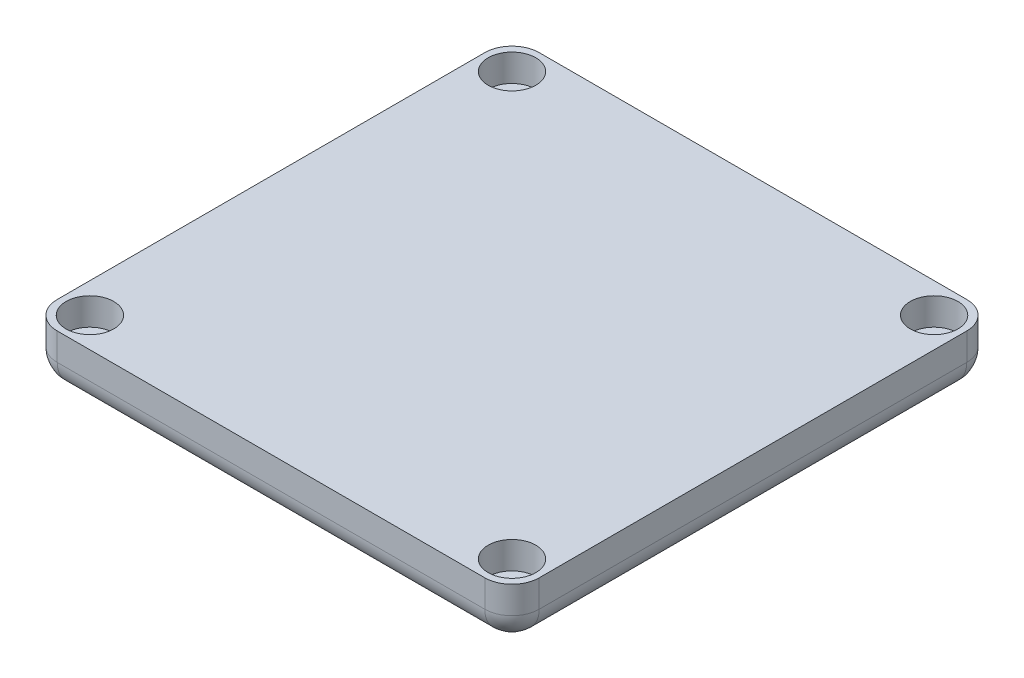
ISO-10303-21;
HEADER;
FILE_DESCRIPTION(('STEP AP214'),'2;1');
FILE_NAME('part.step','',(''),(''),'','','');
FILE_SCHEMA(('AUTOMOTIVE_DESIGN { 1 0 10303 214 1 1 1 1 }'));
ENDSEC;
DATA;
#1=APPLICATION_CONTEXT('core data for automotive mechanical design processes');
#2=APPLICATION_PROTOCOL_DEFINITION('international standard','automotive_design',2000,#1);
#3=PRODUCT_CONTEXT('',#1,'mechanical');
#4=PRODUCT('Part','Part','',(#3));
#5=PRODUCT_RELATED_PRODUCT_CATEGORY('part','',(#4));
#6=PRODUCT_DEFINITION_FORMATION('','',#4);
#7=PRODUCT_DEFINITION_CONTEXT('part definition',#1,'design');
#8=PRODUCT_DEFINITION('design','',#6,#7);
#9=PRODUCT_DEFINITION_SHAPE('','',#8);
#10=(LENGTH_UNIT() NAMED_UNIT(*) SI_UNIT(.MILLI.,.METRE.));
#11=(NAMED_UNIT(*) PLANE_ANGLE_UNIT() SI_UNIT($,.RADIAN.));
#12=(NAMED_UNIT(*) SI_UNIT($,.STERADIAN.) SOLID_ANGLE_UNIT());
#13=UNCERTAINTY_MEASURE_WITH_UNIT(LENGTH_MEASURE(1.E-05),#10,'distance_accuracy_value','');
#14=(GEOMETRIC_REPRESENTATION_CONTEXT(3) GLOBAL_UNCERTAINTY_ASSIGNED_CONTEXT((#13)) GLOBAL_UNIT_ASSIGNED_CONTEXT((#10,
#11,#12)) REPRESENTATION_CONTEXT('',''));
#15=CARTESIAN_POINT('',(0.,0.,0.));
#16=DIRECTION('',(0.,0.,1.));
#17=DIRECTION('',(1.,0.,0.));
#18=AXIS2_PLACEMENT_3D('',#15,#16,#17);
#19=CARTESIAN_POINT('',(17.7,4.,17.7));
#20=DIRECTION('',(-1.,0.,0.));
#21=DIRECTION('',(0.,0.,1.));
#22=AXIS2_PLACEMENT_3D('',#19,#20,#21);
#23=PLANE('',#22);
#24=DIRECTION('',(0.,0.,-1.));
#25=VECTOR('',#24,1.);
#26=CARTESIAN_POINT('',(17.7,2.,-17.7));
#27=LINE('',#26,#25);
#28=CARTESIAN_POINT('',(17.7,2.,15.7));
#29=VERTEX_POINT('',#28);
#30=CARTESIAN_POINT('',(17.7,2.,-15.7));
#31=VERTEX_POINT('',#30);
#32=EDGE_CURVE('E183',#29,#31,#27,.T.);
#33=ORIENTED_EDGE('',*,*,#32,.T.);
#34=DIRECTION('',(0.,-1.,0.));
#35=VECTOR('',#34,1.);
#36=CARTESIAN_POINT('',(17.7,4.,-15.7));
#37=LINE('',#36,#35);
#38=CARTESIAN_POINT('',(17.7,4.,-15.7));
#39=VERTEX_POINT('',#38);
#40=EDGE_CURVE('E186',#31,#39,#37,.F.);
#41=ORIENTED_EDGE('',*,*,#40,.T.);
#42=DIRECTION('',(0.,0.,-1.));
#43=VECTOR('',#42,1.);
#44=CARTESIAN_POINT('',(17.7,4.,17.7));
#45=LINE('',#44,#43);
#46=CARTESIAN_POINT('',(17.7,4.,15.7));
#47=VERTEX_POINT('',#46);
#48=EDGE_CURVE('E238',#47,#39,#45,.T.);
#49=ORIENTED_EDGE('',*,*,#48,.F.);
#50=DIRECTION('',(0.,-1.,0.));
#51=VECTOR('',#50,1.);
#52=CARTESIAN_POINT('',(17.7,4.,15.7));
#53=LINE('',#52,#51);
#54=EDGE_CURVE('E180',#47,#29,#53,.T.);
#55=ORIENTED_EDGE('',*,*,#54,.T.);
#56=EDGE_LOOP('',(#33,#41,#49,#55));
#57=FACE_BOUND('',#56,.T.);
#58=ADVANCED_FACE('F38',(#57),#23,.F.);
#59=CARTESIAN_POINT('',(-17.7,4.,-17.7));
#60=DIRECTION('',(0.,0.,1.));
#61=DIRECTION('',(1.,0.,0.));
#62=AXIS2_PLACEMENT_3D('',#59,#60,#61);
#63=PLANE('',#62);
#64=DIRECTION('',(-1.,0.,0.));
#65=VECTOR('',#64,1.);
#66=CARTESIAN_POINT('',(-17.7,2.,-17.7));
#67=LINE('',#66,#65);
#68=CARTESIAN_POINT('',(15.7,2.,-17.7));
#69=VERTEX_POINT('',#68);
#70=CARTESIAN_POINT('',(-15.7,2.,-17.7));
#71=VERTEX_POINT('',#70);
#72=EDGE_CURVE('E150',#69,#71,#67,.T.);
#73=ORIENTED_EDGE('',*,*,#72,.T.);
#74=DIRECTION('',(0.,-1.,0.));
#75=VECTOR('',#74,1.);
#76=CARTESIAN_POINT('',(-15.7,4.,-17.7));
#77=LINE('',#76,#75);
#78=CARTESIAN_POINT('',(-15.7,4.,-17.7));
#79=VERTEX_POINT('',#78);
#80=EDGE_CURVE('E157',#71,#79,#77,.F.);
#81=ORIENTED_EDGE('',*,*,#80,.T.);
#82=DIRECTION('',(-1.,0.,0.));
#83=VECTOR('',#82,1.);
#84=CARTESIAN_POINT('',(-17.7,4.,-17.7));
#85=LINE('',#84,#83);
#86=CARTESIAN_POINT('',(15.7,4.,-17.7));
#87=VERTEX_POINT('',#86);
#88=EDGE_CURVE('E122',#87,#79,#85,.T.);
#89=ORIENTED_EDGE('',*,*,#88,.F.);
#90=DIRECTION('',(0.,-1.,0.));
#91=VECTOR('',#90,1.);
#92=CARTESIAN_POINT('',(15.7,4.,-17.7));
#93=LINE('',#92,#91);
#94=EDGE_CURVE('E144',#87,#69,#93,.T.);
#95=ORIENTED_EDGE('',*,*,#94,.T.);
#96=EDGE_LOOP('',(#73,#81,#89,#95));
#97=FACE_BOUND('',#96,.T.);
#98=ADVANCED_FACE('F286',(#97),#63,.F.);
#99=CARTESIAN_POINT('',(-17.7,4.,17.7));
#100=DIRECTION('',(1.,0.,0.));
#101=DIRECTION('',(0.,0.,-1.));
#102=AXIS2_PLACEMENT_3D('',#99,#100,#101);
#103=PLANE('',#102);
#104=DIRECTION('',(0.,0.,1.));
#105=VECTOR('',#104,1.);
#106=CARTESIAN_POINT('',(-17.7,4.,17.7));
#107=LINE('',#106,#105);
#108=CARTESIAN_POINT('',(-17.7,4.,-15.7));
#109=VERTEX_POINT('',#108);
#110=CARTESIAN_POINT('',(-17.7,4.,15.7));
#111=VERTEX_POINT('',#110);
#112=EDGE_CURVE('E119',#109,#111,#107,.T.);
#113=ORIENTED_EDGE('',*,*,#112,.F.);
#114=DIRECTION('',(0.,-1.,0.));
#115=VECTOR('',#114,1.);
#116=CARTESIAN_POINT('',(-17.7,4.,-15.7));
#117=LINE('',#116,#115);
#118=CARTESIAN_POINT('',(-17.7,2.,-15.7));
#119=VERTEX_POINT('',#118);
#120=EDGE_CURVE('E133',#109,#119,#117,.T.);
#121=ORIENTED_EDGE('',*,*,#120,.T.);
#122=DIRECTION('',(0.,0.,1.));
#123=VECTOR('',#122,1.);
#124=CARTESIAN_POINT('',(-17.7,2.,17.7));
#125=LINE('',#124,#123);
#126=CARTESIAN_POINT('',(-17.7,2.,15.7));
#127=VERTEX_POINT('',#126);
#128=EDGE_CURVE('E145',#119,#127,#125,.T.);
#129=ORIENTED_EDGE('',*,*,#128,.T.);
#130=DIRECTION('',(0.,-1.,0.));
#131=VECTOR('',#130,1.);
#132=CARTESIAN_POINT('',(-17.7,4.,15.7));
#133=LINE('',#132,#131);
#134=EDGE_CURVE('E135',#127,#111,#133,.F.);
#135=ORIENTED_EDGE('',*,*,#134,.T.);
#136=EDGE_LOOP('',(#113,#121,#129,#135));
#137=FACE_BOUND('',#136,.T.);
#138=ADVANCED_FACE('F132',(#137),#103,.F.);
#139=CARTESIAN_POINT('',(-17.7,4.,17.7));
#140=DIRECTION('',(0.,0.,-1.));
#141=DIRECTION('',(-1.,0.,0.));
#142=AXIS2_PLACEMENT_3D('',#139,#140,#141);
#143=PLANE('',#142);
#144=DIRECTION('',(1.,0.,0.));
#145=VECTOR('',#144,1.);
#146=CARTESIAN_POINT('',(17.7,2.,17.7));
#147=LINE('',#146,#145);
#148=CARTESIAN_POINT('',(-15.7,2.,17.7));
#149=VERTEX_POINT('',#148);
#150=CARTESIAN_POINT('',(15.7,2.,17.7));
#151=VERTEX_POINT('',#150);
#152=EDGE_CURVE('E48',#149,#151,#147,.T.);
#153=ORIENTED_EDGE('',*,*,#152,.T.);
#154=DIRECTION('',(0.,-1.,0.));
#155=VECTOR('',#154,1.);
#156=CARTESIAN_POINT('',(15.7,4.,17.7));
#157=LINE('',#156,#155);
#158=CARTESIAN_POINT('',(15.7,4.,17.7));
#159=VERTEX_POINT('',#158);
#160=EDGE_CURVE('E11',#151,#159,#157,.F.);
#161=ORIENTED_EDGE('',*,*,#160,.T.);
#162=DIRECTION('',(1.,0.,0.));
#163=VECTOR('',#162,1.);
#164=CARTESIAN_POINT('',(-17.7,4.,17.7));
#165=LINE('',#164,#163);
#166=CARTESIAN_POINT('',(-15.7,4.,17.7));
#167=VERTEX_POINT('',#166);
#168=EDGE_CURVE('E137',#167,#159,#165,.T.);
#169=ORIENTED_EDGE('',*,*,#168,.F.);
#170=DIRECTION('',(0.,-1.,0.));
#171=VECTOR('',#170,1.);
#172=CARTESIAN_POINT('',(-15.7,4.,17.7));
#173=LINE('',#172,#171);
#174=EDGE_CURVE('E59',#167,#149,#173,.T.);
#175=ORIENTED_EDGE('',*,*,#174,.T.);
#176=EDGE_LOOP('',(#153,#161,#169,#175));
#177=FACE_BOUND('',#176,.T.);
#178=ADVANCED_FACE('F541',(#177),#143,.F.);
#179=CARTESIAN_POINT('',(0.,4.,0.));
#180=DIRECTION('',(0.,-1.,0.));
#181=DIRECTION('',(0.,0.,-1.));
#182=AXIS2_PLACEMENT_3D('',#179,#180,#181);
#183=PLANE('',#182);
#184=CARTESIAN_POINT('',(-15.5,4.,15.5));
#185=DIRECTION('',(0.,1.,0.));
#186=DIRECTION('',(0.,0.,1.));
#187=AXIS2_PLACEMENT_3D('',#184,#185,#186);
#188=CIRCLE('',#187,1.75);
#189=CARTESIAN_POINT('',(-15.5,4.,17.25));
#190=VERTEX_POINT('',#189);
#191=EDGE_CURVE('E583',#190,#190,#188,.T.);
#192=ORIENTED_EDGE('',*,*,#191,.F.);
#193=EDGE_LOOP('',(#192));
#194=FACE_BOUND('',#193,.T.);
#195=CARTESIAN_POINT('',(15.5,4.,15.5));
#196=DIRECTION('',(0.,1.,0.));
#197=DIRECTION('',(0.,0.,1.));
#198=AXIS2_PLACEMENT_3D('',#195,#196,#197);
#199=CIRCLE('',#198,1.75);
#200=CARTESIAN_POINT('',(15.5,4.,17.25));
#201=VERTEX_POINT('',#200);
#202=EDGE_CURVE('E587',#201,#201,#199,.T.);
#203=ORIENTED_EDGE('',*,*,#202,.F.);
#204=EDGE_LOOP('',(#203));
#205=FACE_BOUND('',#204,.T.);
#206=CARTESIAN_POINT('',(15.5,4.,-15.5));
#207=DIRECTION('',(0.,1.,0.));
#208=DIRECTION('',(0.,0.,1.));
#209=AXIS2_PLACEMENT_3D('',#206,#207,#208);
#210=CIRCLE('',#209,1.75);
#211=CARTESIAN_POINT('',(15.5,4.,-13.75));
#212=VERTEX_POINT('',#211);
#213=EDGE_CURVE('E591',#212,#212,#210,.T.);
#214=ORIENTED_EDGE('',*,*,#213,.F.);
#215=EDGE_LOOP('',(#214));
#216=FACE_BOUND('',#215,.T.);
#217=CARTESIAN_POINT('',(-15.5,4.,-15.5));
#218=DIRECTION('',(0.,1.,0.));
#219=DIRECTION('',(0.,0.,1.));
#220=AXIS2_PLACEMENT_3D('',#217,#218,#219);
#221=CIRCLE('',#220,1.75);
#222=CARTESIAN_POINT('',(-15.5,4.,-13.75));
#223=VERTEX_POINT('',#222);
#224=EDGE_CURVE('E252',#223,#223,#221,.T.);
#225=ORIENTED_EDGE('',*,*,#224,.F.);
#226=EDGE_LOOP('',(#225));
#227=FACE_BOUND('',#226,.T.);
#228=ORIENTED_EDGE('',*,*,#88,.T.);
#229=CARTESIAN_POINT('',(-15.7,4.,-15.7));
#230=DIRECTION('',(0.,-1.,0.));
#231=DIRECTION('',(0.,0.,-1.));
#232=AXIS2_PLACEMENT_3D('',#229,#230,#231);
#233=CIRCLE('',#232,2.);
#234=EDGE_CURVE('E116',#79,#109,#233,.F.);
#235=ORIENTED_EDGE('',*,*,#234,.T.);
#236=ORIENTED_EDGE('',*,*,#112,.T.);
#237=CARTESIAN_POINT('',(-15.7,4.,15.7));
#238=DIRECTION('',(0.,-1.,0.));
#239=DIRECTION('',(0.,0.,-1.));
#240=AXIS2_PLACEMENT_3D('',#237,#238,#239);
#241=CIRCLE('',#240,2.);
#242=EDGE_CURVE('E160',#111,#167,#241,.F.);
#243=ORIENTED_EDGE('',*,*,#242,.T.);
#244=ORIENTED_EDGE('',*,*,#168,.T.);
#245=CARTESIAN_POINT('',(15.7,4.,15.7));
#246=DIRECTION('',(0.,-1.,0.));
#247=DIRECTION('',(0.,0.,-1.));
#248=AXIS2_PLACEMENT_3D('',#245,#246,#247);
#249=CIRCLE('',#248,2.);
#250=EDGE_CURVE('E163',#159,#47,#249,.F.);
#251=ORIENTED_EDGE('',*,*,#250,.T.);
#252=ORIENTED_EDGE('',*,*,#48,.T.);
#253=CARTESIAN_POINT('',(15.7,4.,-15.7));
#254=DIRECTION('',(0.,-1.,0.));
#255=DIRECTION('',(0.,0.,-1.));
#256=AXIS2_PLACEMENT_3D('',#253,#254,#255);
#257=CIRCLE('',#256,2.);
#258=EDGE_CURVE('E128',#39,#87,#257,.F.);
#259=ORIENTED_EDGE('',*,*,#258,.T.);
#260=EDGE_LOOP('',(#228,#235,#236,#243,#244,#251,#252,#259));
#261=FACE_BOUND('',#260,.T.);
#262=ADVANCED_FACE('F118',(#194,#205,#216,#227,#261),#183,.F.);
#263=CARTESIAN_POINT('',(0.,0.,0.));
#264=DIRECTION('',(0.,-1.,0.));
#265=DIRECTION('',(0.,0.,-1.));
#266=AXIS2_PLACEMENT_3D('',#263,#264,#265);
#267=PLANE('',#266);
#268=DIRECTION('',(0.,0.,1.));
#269=VECTOR('',#268,1.);
#270=CARTESIAN_POINT('',(-15.7,0.,-17.7));
#271=LINE('',#270,#269);
#272=CARTESIAN_POINT('',(-15.7,0.,15.7));
#273=VERTEX_POINT('',#272);
#274=CARTESIAN_POINT('',(-15.7,0.,-15.7));
#275=VERTEX_POINT('',#274);
#276=EDGE_CURVE('E127',#273,#275,#271,.F.);
#277=ORIENTED_EDGE('',*,*,#276,.T.);
#278=DIRECTION('',(-1.,0.,0.));
#279=VECTOR('',#278,1.);
#280=CARTESIAN_POINT('',(17.7,0.,-15.7));
#281=LINE('',#280,#279);
#282=CARTESIAN_POINT('',(15.7,0.,-15.7));
#283=VERTEX_POINT('',#282);
#284=EDGE_CURVE('E176',#275,#283,#281,.F.);
#285=ORIENTED_EDGE('',*,*,#284,.T.);
#286=DIRECTION('',(0.,0.,-1.));
#287=VECTOR('',#286,1.);
#288=CARTESIAN_POINT('',(15.7,0.,17.7));
#289=LINE('',#288,#287);
#290=CARTESIAN_POINT('',(15.7,0.,15.7));
#291=VERTEX_POINT('',#290);
#292=EDGE_CURVE('E173',#283,#291,#289,.F.);
#293=ORIENTED_EDGE('',*,*,#292,.T.);
#294=DIRECTION('',(1.,0.,0.));
#295=VECTOR('',#294,1.);
#296=CARTESIAN_POINT('',(-17.7,0.,15.7));
#297=LINE('',#296,#295);
#298=EDGE_CURVE('E170',#291,#273,#297,.F.);
#299=ORIENTED_EDGE('',*,*,#298,.T.);
#300=EDGE_LOOP('',(#277,#285,#293,#299));
#301=FACE_BOUND('',#300,.T.);
#302=ADVANCED_FACE('F303',(#301),#267,.T.);
#303=CARTESIAN_POINT('',(15.7,4.,15.7));
#304=DIRECTION('',(0.,-1.,0.));
#305=DIRECTION('',(0.,0.,-1.));
#306=AXIS2_PLACEMENT_3D('',#303,#304,#305);
#307=CYLINDRICAL_SURFACE('',#306,2.);
#308=CARTESIAN_POINT('',(15.7,2.,15.7));
#309=DIRECTION('',(0.,-1.,0.));
#310=DIRECTION('',(0.,0.,-1.));
#311=AXIS2_PLACEMENT_3D('',#308,#309,#310);
#312=CIRCLE('',#311,2.);
#313=EDGE_CURVE('E42',#29,#151,#312,.T.);
#314=ORIENTED_EDGE('',*,*,#313,.F.);
#315=ORIENTED_EDGE('',*,*,#54,.F.);
#316=ORIENTED_EDGE('',*,*,#250,.F.);
#317=ORIENTED_EDGE('',*,*,#160,.F.);
#318=EDGE_LOOP('',(#314,#315,#316,#317));
#319=FACE_BOUND('',#318,.T.);
#320=ADVANCED_FACE('F40',(#319),#307,.T.);
#321=CARTESIAN_POINT('',(15.7,2.,15.7));
#322=DIRECTION('',(0.,0.,1.));
#323=DIRECTION('',(1.,0.,0.));
#324=AXIS2_PLACEMENT_3D('',#321,#322,#323);
#325=SPHERICAL_SURFACE('',#324,2.);
#326=CARTESIAN_POINT('',(15.7,2.,15.7));
#327=DIRECTION('',(0.,0.,1.));
#328=DIRECTION('',(1.,0.,0.));
#329=AXIS2_PLACEMENT_3D('',#326,#327,#328);
#330=CIRCLE('',#329,2.);
#331=EDGE_CURVE('E226',#29,#291,#330,.F.);
#332=ORIENTED_EDGE('',*,*,#331,.F.);
#333=ORIENTED_EDGE('',*,*,#313,.T.);
#334=CARTESIAN_POINT('',(15.7,2.,15.7));
#335=DIRECTION('',(1.,0.,0.));
#336=DIRECTION('',(0.,0.,-1.));
#337=AXIS2_PLACEMENT_3D('',#334,#335,#336);
#338=CIRCLE('',#337,2.);
#339=EDGE_CURVE('E229',#291,#151,#338,.F.);
#340=ORIENTED_EDGE('',*,*,#339,.F.);
#341=EDGE_LOOP('',(#332,#333,#340));
#342=FACE_BOUND('',#341,.T.);
#343=ADVANCED_FACE('F304',(#342),#325,.T.);
#344=CARTESIAN_POINT('',(-15.7,4.,15.7));
#345=DIRECTION('',(0.,-1.,0.));
#346=DIRECTION('',(0.,0.,-1.));
#347=AXIS2_PLACEMENT_3D('',#344,#345,#346);
#348=CYLINDRICAL_SURFACE('',#347,2.);
#349=ORIENTED_EDGE('',*,*,#242,.F.);
#350=ORIENTED_EDGE('',*,*,#134,.F.);
#351=CARTESIAN_POINT('',(-15.7,2.,15.7));
#352=DIRECTION('',(0.,-1.,0.));
#353=DIRECTION('',(0.,0.,-1.));
#354=AXIS2_PLACEMENT_3D('',#351,#352,#353);
#355=CIRCLE('',#354,2.);
#356=EDGE_CURVE('E222',#149,#127,#355,.T.);
#357=ORIENTED_EDGE('',*,*,#356,.F.);
#358=ORIENTED_EDGE('',*,*,#174,.F.);
#359=EDGE_LOOP('',(#349,#350,#357,#358));
#360=FACE_BOUND('',#359,.T.);
#361=ADVANCED_FACE('F297',(#360),#348,.T.);
#362=CARTESIAN_POINT('',(-17.7,2.,15.7));
#363=DIRECTION('',(-1.,0.,0.));
#364=DIRECTION('',(0.,0.,1.));
#365=AXIS2_PLACEMENT_3D('',#362,#363,#364);
#366=CYLINDRICAL_SURFACE('',#365,2.);
#367=ORIENTED_EDGE('',*,*,#339,.T.);
#368=ORIENTED_EDGE('',*,*,#152,.F.);
#369=CARTESIAN_POINT('',(-15.7,2.,15.7));
#370=DIRECTION('',(-1.,0.,0.));
#371=DIRECTION('',(0.,0.,1.));
#372=AXIS2_PLACEMENT_3D('',#369,#370,#371);
#373=CIRCLE('',#372,2.);
#374=EDGE_CURVE('E218',#273,#149,#373,.T.);
#375=ORIENTED_EDGE('',*,*,#374,.F.);
#376=ORIENTED_EDGE('',*,*,#298,.F.);
#377=EDGE_LOOP('',(#367,#368,#375,#376));
#378=FACE_BOUND('',#377,.T.);
#379=ADVANCED_FACE('F301',(#378),#366,.T.);
#380=CARTESIAN_POINT('',(15.7,2.,17.7));
#381=DIRECTION('',(0.,0.,1.));
#382=DIRECTION('',(1.,0.,0.));
#383=AXIS2_PLACEMENT_3D('',#380,#381,#382);
#384=CYLINDRICAL_SURFACE('',#383,2.);
#385=ORIENTED_EDGE('',*,*,#331,.T.);
#386=ORIENTED_EDGE('',*,*,#292,.F.);
#387=CARTESIAN_POINT('',(15.7,2.,-15.7));
#388=DIRECTION('',(0.,0.,-1.));
#389=DIRECTION('',(-1.,0.,0.));
#390=AXIS2_PLACEMENT_3D('',#387,#388,#389);
#391=CIRCLE('',#390,2.);
#392=EDGE_CURVE('E214',#31,#283,#391,.T.);
#393=ORIENTED_EDGE('',*,*,#392,.F.);
#394=ORIENTED_EDGE('',*,*,#32,.F.);
#395=EDGE_LOOP('',(#385,#386,#393,#394));
#396=FACE_BOUND('',#395,.T.);
#397=ADVANCED_FACE('F277',(#396),#384,.T.);
#398=CARTESIAN_POINT('',(15.7,4.,-15.7));
#399=DIRECTION('',(0.,-1.,0.));
#400=DIRECTION('',(0.,0.,-1.));
#401=AXIS2_PLACEMENT_3D('',#398,#399,#400);
#402=CYLINDRICAL_SURFACE('',#401,2.);
#403=ORIENTED_EDGE('',*,*,#258,.F.);
#404=ORIENTED_EDGE('',*,*,#40,.F.);
#405=CARTESIAN_POINT('',(15.7,2.,-15.7));
#406=DIRECTION('',(0.,-1.,0.));
#407=DIRECTION('',(0.,0.,-1.));
#408=AXIS2_PLACEMENT_3D('',#405,#406,#407);
#409=CIRCLE('',#408,2.);
#410=EDGE_CURVE('E210',#69,#31,#409,.T.);
#411=ORIENTED_EDGE('',*,*,#410,.F.);
#412=ORIENTED_EDGE('',*,*,#94,.F.);
#413=EDGE_LOOP('',(#403,#404,#411,#412));
#414=FACE_BOUND('',#413,.T.);
#415=ADVANCED_FACE('F272',(#414),#402,.T.);
#416=CARTESIAN_POINT('',(-15.7,2.,15.7));
#417=DIRECTION('',(0.,0.,1.));
#418=DIRECTION('',(1.,0.,0.));
#419=AXIS2_PLACEMENT_3D('',#416,#417,#418);
#420=SPHERICAL_SURFACE('',#419,2.);
#421=ORIENTED_EDGE('',*,*,#374,.T.);
#422=ORIENTED_EDGE('',*,*,#356,.T.);
#423=CARTESIAN_POINT('',(-15.7,2.,15.7));
#424=DIRECTION('',(0.,0.,1.));
#425=DIRECTION('',(1.,0.,0.));
#426=AXIS2_PLACEMENT_3D('',#423,#424,#425);
#427=CIRCLE('',#426,2.);
#428=EDGE_CURVE('E206',#273,#127,#427,.F.);
#429=ORIENTED_EDGE('',*,*,#428,.F.);
#430=EDGE_LOOP('',(#421,#422,#429));
#431=FACE_BOUND('',#430,.T.);
#432=ADVANCED_FACE('F299',(#431),#420,.T.);
#433=CARTESIAN_POINT('',(15.7,2.,-15.7));
#434=DIRECTION('',(1.,0.,0.));
#435=DIRECTION('',(0.,0.,-1.));
#436=AXIS2_PLACEMENT_3D('',#433,#434,#435);
#437=SPHERICAL_SURFACE('',#436,2.);
#438=ORIENTED_EDGE('',*,*,#410,.T.);
#439=ORIENTED_EDGE('',*,*,#392,.T.);
#440=CARTESIAN_POINT('',(15.7,2.,-15.7));
#441=DIRECTION('',(1.,0.,0.));
#442=DIRECTION('',(0.,0.,-1.));
#443=AXIS2_PLACEMENT_3D('',#440,#441,#442);
#444=CIRCLE('',#443,2.);
#445=EDGE_CURVE('E203',#69,#283,#444,.F.);
#446=ORIENTED_EDGE('',*,*,#445,.F.);
#447=EDGE_LOOP('',(#438,#439,#446));
#448=FACE_BOUND('',#447,.T.);
#449=ADVANCED_FACE('F279',(#448),#437,.T.);
#450=CARTESIAN_POINT('',(-15.7,2.,17.7));
#451=DIRECTION('',(0.,0.,-1.));
#452=DIRECTION('',(-1.,0.,0.));
#453=AXIS2_PLACEMENT_3D('',#450,#451,#452);
#454=CYLINDRICAL_SURFACE('',#453,2.);
#455=ORIENTED_EDGE('',*,*,#428,.T.);
#456=ORIENTED_EDGE('',*,*,#128,.F.);
#457=CARTESIAN_POINT('',(-15.7,2.,-15.7));
#458=DIRECTION('',(0.,0.,-1.));
#459=DIRECTION('',(-1.,0.,0.));
#460=AXIS2_PLACEMENT_3D('',#457,#458,#459);
#461=CIRCLE('',#460,2.);
#462=EDGE_CURVE('E200',#275,#119,#461,.T.);
#463=ORIENTED_EDGE('',*,*,#462,.F.);
#464=ORIENTED_EDGE('',*,*,#276,.F.);
#465=EDGE_LOOP('',(#455,#456,#463,#464));
#466=FACE_BOUND('',#465,.T.);
#467=ADVANCED_FACE('F293',(#466),#454,.T.);
#468=CARTESIAN_POINT('',(-17.7,2.,-15.7));
#469=DIRECTION('',(1.,0.,0.));
#470=DIRECTION('',(0.,0.,-1.));
#471=AXIS2_PLACEMENT_3D('',#468,#469,#470);
#472=CYLINDRICAL_SURFACE('',#471,2.);
#473=ORIENTED_EDGE('',*,*,#445,.T.);
#474=ORIENTED_EDGE('',*,*,#284,.F.);
#475=CARTESIAN_POINT('',(-15.7,2.,-15.7));
#476=DIRECTION('',(-1.,0.,0.));
#477=DIRECTION('',(0.,0.,1.));
#478=AXIS2_PLACEMENT_3D('',#475,#476,#477);
#479=CIRCLE('',#478,2.);
#480=EDGE_CURVE('E195',#71,#275,#479,.T.);
#481=ORIENTED_EDGE('',*,*,#480,.F.);
#482=ORIENTED_EDGE('',*,*,#72,.F.);
#483=EDGE_LOOP('',(#473,#474,#481,#482));
#484=FACE_BOUND('',#483,.T.);
#485=ADVANCED_FACE('F284',(#484),#472,.T.);
#486=CARTESIAN_POINT('',(-15.7,2.,-15.7));
#487=DIRECTION('',(0.,-1.,0.));
#488=DIRECTION('',(0.,0.,-1.));
#489=AXIS2_PLACEMENT_3D('',#486,#487,#488);
#490=SPHERICAL_SURFACE('',#489,2.);
#491=ORIENTED_EDGE('',*,*,#480,.T.);
#492=ORIENTED_EDGE('',*,*,#462,.T.);
#493=CARTESIAN_POINT('',(-15.7,2.,-15.7));
#494=DIRECTION('',(0.,-1.,0.));
#495=DIRECTION('',(0.,0.,-1.));
#496=AXIS2_PLACEMENT_3D('',#493,#494,#495);
#497=CIRCLE('',#496,2.);
#498=EDGE_CURVE('E141',#71,#119,#497,.F.);
#499=ORIENTED_EDGE('',*,*,#498,.F.);
#500=EDGE_LOOP('',(#491,#492,#499));
#501=FACE_BOUND('',#500,.T.);
#502=ADVANCED_FACE('F288',(#501),#490,.T.);
#503=CARTESIAN_POINT('',(-15.7,4.,-15.7));
#504=DIRECTION('',(0.,-1.,0.));
#505=DIRECTION('',(0.,0.,-1.));
#506=AXIS2_PLACEMENT_3D('',#503,#504,#505);
#507=CYLINDRICAL_SURFACE('',#506,2.);
#508=ORIENTED_EDGE('',*,*,#234,.F.);
#509=ORIENTED_EDGE('',*,*,#80,.F.);
#510=ORIENTED_EDGE('',*,*,#498,.T.);
#511=ORIENTED_EDGE('',*,*,#120,.F.);
#512=EDGE_LOOP('',(#508,#509,#510,#511));
#513=FACE_BOUND('',#512,.T.);
#514=ADVANCED_FACE('F139',(#513),#507,.T.);
#515=CARTESIAN_POINT('',(-15.5,2.,-15.5));
#516=DIRECTION('',(0.,1.,0.));
#517=DIRECTION('',(0.,0.,1.));
#518=AXIS2_PLACEMENT_3D('',#515,#516,#517);
#519=CYLINDRICAL_SURFACE('',#518,1.75);
#520=CARTESIAN_POINT('',(-15.5,2.,-15.5));
#521=DIRECTION('',(0.,1.,0.));
#522=DIRECTION('',(0.,0.,1.));
#523=AXIS2_PLACEMENT_3D('',#520,#521,#522);
#524=CIRCLE('',#523,1.75);
#525=CARTESIAN_POINT('',(-15.5,2.,-13.75));
#526=VERTEX_POINT('',#525);
#527=EDGE_CURVE('E196',#526,#526,#524,.T.);
#528=ORIENTED_EDGE('',*,*,#527,.F.);
#529=EDGE_LOOP('',(#528));
#530=FACE_BOUND('',#529,.T.);
#531=ORIENTED_EDGE('',*,*,#224,.T.);
#532=EDGE_LOOP('',(#531));
#533=FACE_BOUND('',#532,.T.);
#534=ADVANCED_FACE('F321',(#530,#533),#519,.F.);
#535=CARTESIAN_POINT('',(-15.5,2.,-15.5));
#536=DIRECTION('',(0.,1.,0.));
#537=DIRECTION('',(0.,0.,1.));
#538=AXIS2_PLACEMENT_3D('',#535,#536,#537);
#539=PLANE('',#538);
#540=ORIENTED_EDGE('',*,*,#527,.T.);
#541=EDGE_LOOP('',(#540));
#542=FACE_BOUND('',#541,.T.);
#543=ADVANCED_FACE('F380',(#542),#539,.T.);
#544=CARTESIAN_POINT('',(15.5,2.,-15.5));
#545=DIRECTION('',(0.,1.,0.));
#546=DIRECTION('',(0.,0.,1.));
#547=AXIS2_PLACEMENT_3D('',#544,#545,#546);
#548=CYLINDRICAL_SURFACE('',#547,1.75);
#549=CARTESIAN_POINT('',(15.5,2.,-15.5));
#550=DIRECTION('',(0.,1.,0.));
#551=DIRECTION('',(0.,0.,1.));
#552=AXIS2_PLACEMENT_3D('',#549,#550,#551);
#553=CIRCLE('',#552,1.75);
#554=CARTESIAN_POINT('',(15.5,2.,-13.75));
#555=VERTEX_POINT('',#554);
#556=EDGE_CURVE('E600',#555,#555,#553,.T.);
#557=ORIENTED_EDGE('',*,*,#556,.F.);
#558=EDGE_LOOP('',(#557));
#559=FACE_BOUND('',#558,.T.);
#560=ORIENTED_EDGE('',*,*,#213,.T.);
#561=EDGE_LOOP('',(#560));
#562=FACE_BOUND('',#561,.T.);
#563=ADVANCED_FACE('F388',(#559,#562),#548,.F.);
#564=CARTESIAN_POINT('',(15.5,2.,-15.5));
#565=DIRECTION('',(0.,1.,0.));
#566=DIRECTION('',(0.,0.,1.));
#567=AXIS2_PLACEMENT_3D('',#564,#565,#566);
#568=PLANE('',#567);
#569=ORIENTED_EDGE('',*,*,#556,.T.);
#570=EDGE_LOOP('',(#569));
#571=FACE_BOUND('',#570,.T.);
#572=ADVANCED_FACE('F396',(#571),#568,.T.);
#573=CARTESIAN_POINT('',(15.5,2.,15.5));
#574=DIRECTION('',(0.,1.,0.));
#575=DIRECTION('',(0.,0.,1.));
#576=AXIS2_PLACEMENT_3D('',#573,#574,#575);
#577=CYLINDRICAL_SURFACE('',#576,1.75);
#578=CARTESIAN_POINT('',(15.5,2.,15.5));
#579=DIRECTION('',(0.,1.,0.));
#580=DIRECTION('',(0.,0.,1.));
#581=AXIS2_PLACEMENT_3D('',#578,#579,#580);
#582=CIRCLE('',#581,1.75);
#583=CARTESIAN_POINT('',(15.5,2.,17.25));
#584=VERTEX_POINT('',#583);
#585=EDGE_CURVE('E610',#584,#584,#582,.T.);
#586=ORIENTED_EDGE('',*,*,#585,.F.);
#587=EDGE_LOOP('',(#586));
#588=FACE_BOUND('',#587,.T.);
#589=ORIENTED_EDGE('',*,*,#202,.T.);
#590=EDGE_LOOP('',(#589));
#591=FACE_BOUND('',#590,.T.);
#592=ADVANCED_FACE('F404',(#588,#591),#577,.F.);
#593=CARTESIAN_POINT('',(15.5,2.,15.5));
#594=DIRECTION('',(0.,1.,0.));
#595=DIRECTION('',(0.,0.,1.));
#596=AXIS2_PLACEMENT_3D('',#593,#594,#595);
#597=PLANE('',#596);
#598=ORIENTED_EDGE('',*,*,#585,.T.);
#599=EDGE_LOOP('',(#598));
#600=FACE_BOUND('',#599,.T.);
#601=ADVANCED_FACE('F412',(#600),#597,.T.);
#602=CARTESIAN_POINT('',(-15.5,2.,15.5));
#603=DIRECTION('',(0.,1.,0.));
#604=DIRECTION('',(0.,0.,1.));
#605=AXIS2_PLACEMENT_3D('',#602,#603,#604);
#606=CYLINDRICAL_SURFACE('',#605,1.75);
#607=CARTESIAN_POINT('',(-15.5,2.,15.5));
#608=DIRECTION('',(0.,1.,0.));
#609=DIRECTION('',(0.,0.,1.));
#610=AXIS2_PLACEMENT_3D('',#607,#608,#609);
#611=CIRCLE('',#610,1.75);
#612=CARTESIAN_POINT('',(-15.5,2.,17.25));
#613=VERTEX_POINT('',#612);
#614=EDGE_CURVE('E616',#613,#613,#611,.T.);
#615=ORIENTED_EDGE('',*,*,#614,.F.);
#616=EDGE_LOOP('',(#615));
#617=FACE_BOUND('',#616,.T.);
#618=ORIENTED_EDGE('',*,*,#191,.T.);
#619=EDGE_LOOP('',(#618));
#620=FACE_BOUND('',#619,.T.);
#621=ADVANCED_FACE('F420',(#617,#620),#606,.F.);
#622=CARTESIAN_POINT('',(-15.5,2.,15.5));
#623=DIRECTION('',(0.,1.,0.));
#624=DIRECTION('',(0.,0.,1.));
#625=AXIS2_PLACEMENT_3D('',#622,#623,#624);
#626=PLANE('',#625);
#627=ORIENTED_EDGE('',*,*,#614,.T.);
#628=EDGE_LOOP('',(#627));
#629=FACE_BOUND('',#628,.T.);
#630=ADVANCED_FACE('F428',(#629),#626,.T.);
#631=CLOSED_SHELL('',(#58,#98,#138,#178,#262,#302,#320,#343,#361,#379,#397,#415,#432,#449,#467,
#485,#502,#514,#534,#543,#563,#572,#592,#601,#621,#630));
#632=MANIFOLD_SOLID_BREP('B2',#631);
#633=ADVANCED_BREP_SHAPE_REPRESENTATION('',(#18,#632),#14);
#634=SHAPE_DEFINITION_REPRESENTATION(#9,#633);
ENDSEC;
END-ISO-10303-21;
